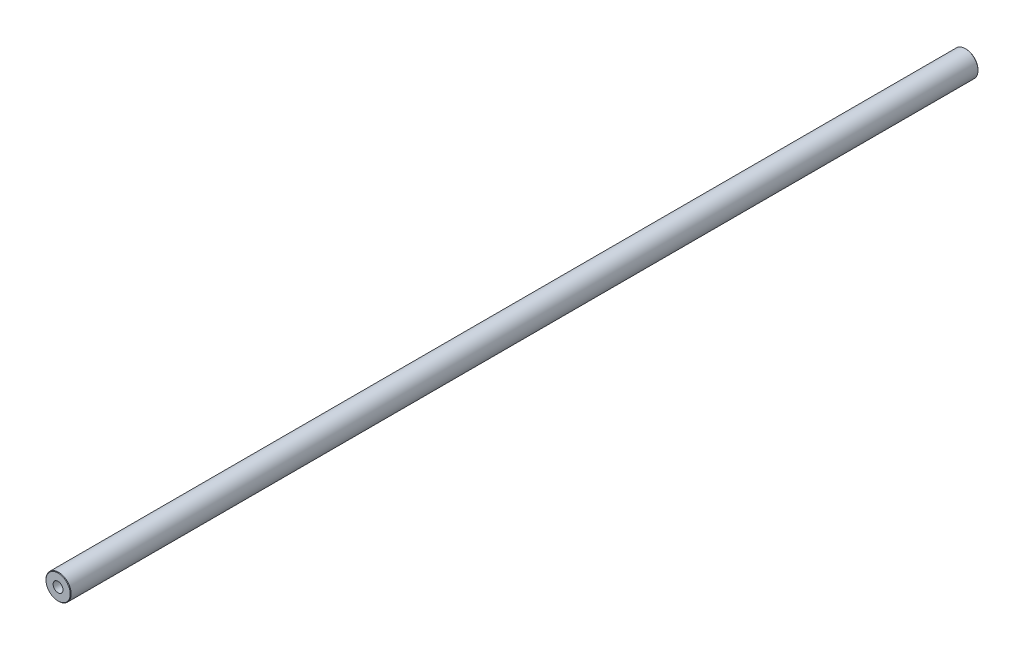
ISO-10303-21;
HEADER;
FILE_DESCRIPTION(('STEP AP214'),'2;1');
FILE_NAME('part.step','',(''),(''),'','','');
FILE_SCHEMA(('AUTOMOTIVE_DESIGN { 1 0 10303 214 1 1 1 1 }'));
ENDSEC;
DATA;
#1=APPLICATION_CONTEXT('core data for automotive mechanical design processes');
#2=APPLICATION_PROTOCOL_DEFINITION('international standard','automotive_design',2000,#1);
#3=PRODUCT_CONTEXT('',#1,'mechanical');
#4=PRODUCT('Part','Part','',(#3));
#5=PRODUCT_RELATED_PRODUCT_CATEGORY('part','',(#4));
#6=PRODUCT_DEFINITION_FORMATION('','',#4);
#7=PRODUCT_DEFINITION_CONTEXT('part definition',#1,'design');
#8=PRODUCT_DEFINITION('design','',#6,#7);
#9=PRODUCT_DEFINITION_SHAPE('','',#8);
#10=(LENGTH_UNIT() NAMED_UNIT(*) SI_UNIT(.MILLI.,.METRE.));
#11=(NAMED_UNIT(*) PLANE_ANGLE_UNIT() SI_UNIT($,.RADIAN.));
#12=(NAMED_UNIT(*) SI_UNIT($,.STERADIAN.) SOLID_ANGLE_UNIT());
#13=UNCERTAINTY_MEASURE_WITH_UNIT(LENGTH_MEASURE(1.E-05),#10,'distance_accuracy_value','');
#14=(GEOMETRIC_REPRESENTATION_CONTEXT(3) GLOBAL_UNCERTAINTY_ASSIGNED_CONTEXT((#13)) GLOBAL_UNIT_ASSIGNED_CONTEXT((#10,
#11,#12)) REPRESENTATION_CONTEXT('',''));
#15=CARTESIAN_POINT('',(0.,0.,0.));
#16=DIRECTION('',(0.,0.,1.));
#17=DIRECTION('',(1.,0.,0.));
#18=AXIS2_PLACEMENT_3D('',#15,#16,#17);
#19=CARTESIAN_POINT('',(0.,0.,228.6));
#20=DIRECTION('',(0.,0.,-1.));
#21=DIRECTION('',(-1.,0.,0.));
#22=AXIS2_PLACEMENT_3D('',#19,#20,#21);
#23=CYLINDRICAL_SURFACE('',#22,6.35);
#24=CARTESIAN_POINT('',(0.,0.,-228.346));
#25=DIRECTION('',(0.,0.,1.));
#26=DIRECTION('',(1.,0.,0.));
#27=AXIS2_PLACEMENT_3D('',#24,#25,#26);
#28=CIRCLE('',#27,6.35);
#29=CARTESIAN_POINT('',(6.35,0.,-228.346));
#30=VERTEX_POINT('',#29);
#31=EDGE_CURVE('E84',#30,#30,#28,.T.);
#32=ORIENTED_EDGE('',*,*,#31,.T.);
#33=EDGE_LOOP('',(#32));
#34=FACE_BOUND('',#33,.T.);
#35=CARTESIAN_POINT('',(0.,0.,228.346));
#36=DIRECTION('',(0.,0.,1.));
#37=DIRECTION('',(1.,0.,0.));
#38=AXIS2_PLACEMENT_3D('',#35,#36,#37);
#39=CIRCLE('',#38,6.35);
#40=CARTESIAN_POINT('',(6.35,0.,228.346));
#41=VERTEX_POINT('',#40);
#42=EDGE_CURVE('E80',#41,#41,#39,.F.);
#43=ORIENTED_EDGE('',*,*,#42,.T.);
#44=EDGE_LOOP('',(#43));
#45=FACE_BOUND('',#44,.T.);
#46=ADVANCED_FACE('F44',(#34,#45),#23,.T.);
#47=CARTESIAN_POINT('',(0.,0.,228.6));
#48=DIRECTION('',(0.,0.,1.));
#49=DIRECTION('',(1.,0.,0.));
#50=AXIS2_PLACEMENT_3D('',#47,#48,#49);
#51=PLANE('',#50);
#52=CARTESIAN_POINT('',(0.,0.,228.6));
#53=DIRECTION('',(0.,0.,1.));
#54=DIRECTION('',(1.,0.,0.));
#55=AXIS2_PLACEMENT_3D('',#52,#53,#54);
#56=CIRCLE('',#55,2.49999999999999);
#57=CARTESIAN_POINT('',(2.49999999999999,0.,228.6));
#58=VERTEX_POINT('',#57);
#59=EDGE_CURVE('E69',#58,#58,#56,.T.);
#60=ORIENTED_EDGE('',*,*,#59,.F.);
#61=EDGE_LOOP('',(#60));
#62=FACE_BOUND('',#61,.T.);
#63=CARTESIAN_POINT('',(0.,0.,228.6));
#64=DIRECTION('',(0.,0.,1.));
#65=DIRECTION('',(1.,0.,0.));
#66=AXIS2_PLACEMENT_3D('',#63,#64,#65);
#67=CIRCLE('',#66,6.09600000000005);
#68=CARTESIAN_POINT('',(6.09600000000005,0.,228.6));
#69=VERTEX_POINT('',#68);
#70=EDGE_CURVE('E11',#69,#69,#67,.T.);
#71=ORIENTED_EDGE('',*,*,#70,.T.);
#72=EDGE_LOOP('',(#71));
#73=FACE_BOUND('',#72,.T.);
#74=ADVANCED_FACE('F101',(#62,#73),#51,.T.);
#75=CARTESIAN_POINT('',(0.,0.,-228.6));
#76=DIRECTION('',(0.,0.,1.));
#77=DIRECTION('',(1.,0.,0.));
#78=AXIS2_PLACEMENT_3D('',#75,#76,#77);
#79=PLANE('',#78);
#80=CARTESIAN_POINT('',(0.,0.,-228.6));
#81=DIRECTION('',(0.,0.,-1.));
#82=DIRECTION('',(-1.,0.,0.));
#83=AXIS2_PLACEMENT_3D('',#80,#81,#82);
#84=CIRCLE('',#83,2.49999999999999);
#85=CARTESIAN_POINT('',(-2.49999999999999,0.,-228.6));
#86=VERTEX_POINT('',#85);
#87=EDGE_CURVE('E70',#86,#86,#84,.T.);
#88=ORIENTED_EDGE('',*,*,#87,.F.);
#89=EDGE_LOOP('',(#88));
#90=FACE_BOUND('',#89,.T.);
#91=CARTESIAN_POINT('',(0.,0.,-228.6));
#92=DIRECTION('',(0.,0.,1.));
#93=DIRECTION('',(1.,0.,0.));
#94=AXIS2_PLACEMENT_3D('',#91,#92,#93);
#95=CIRCLE('',#94,6.09599999999999);
#96=CARTESIAN_POINT('',(6.09599999999999,0.,-228.6));
#97=VERTEX_POINT('',#96);
#98=EDGE_CURVE('E53',#97,#97,#95,.F.);
#99=ORIENTED_EDGE('',*,*,#98,.T.);
#100=EDGE_LOOP('',(#99));
#101=FACE_BOUND('',#100,.T.);
#102=ADVANCED_FACE('F92',(#90,#101),#79,.F.);
#103=CARTESIAN_POINT('',(0.,0.,-228.346));
#104=DIRECTION('',(0.,0.,1.));
#105=DIRECTION('',(1.,0.,0.));
#106=AXIS2_PLACEMENT_3D('',#103,#104,#105);
#107=CONICAL_SURFACE('',#106,6.35,0.785398163397404);
#108=ORIENTED_EDGE('',*,*,#98,.F.);
#109=EDGE_LOOP('',(#108));
#110=FACE_BOUND('',#109,.T.);
#111=ORIENTED_EDGE('',*,*,#31,.F.);
#112=EDGE_LOOP('',(#111));
#113=FACE_BOUND('',#112,.T.);
#114=ADVANCED_FACE('F94',(#110,#113),#107,.T.);
#115=CARTESIAN_POINT('',(0.,0.,228.6));
#116=DIRECTION('',(0.,0.,-1.));
#117=DIRECTION('',(-1.,0.,0.));
#118=AXIS2_PLACEMENT_3D('',#115,#116,#117);
#119=CONICAL_SURFACE('',#118,6.09600000000005,0.785398163397404);
#120=ORIENTED_EDGE('',*,*,#42,.F.);
#121=EDGE_LOOP('',(#120));
#122=FACE_BOUND('',#121,.T.);
#123=ORIENTED_EDGE('',*,*,#70,.F.);
#124=EDGE_LOOP('',(#123));
#125=FACE_BOUND('',#124,.T.);
#126=ADVANCED_FACE('F46',(#122,#125),#119,.T.);
#127=CARTESIAN_POINT('',(0.,0.,203.6));
#128=DIRECTION('',(0.,0.,1.));
#129=DIRECTION('',(1.,0.,0.));
#130=AXIS2_PLACEMENT_3D('',#127,#128,#129);
#131=CONICAL_SURFACE('',#130,2.49999999999999,1.02974425867665);
#132=CARTESIAN_POINT('',(0.,0.,202.097848452431));
#133=VERTEX_POINT('',#132);
#134=VERTEX_LOOP('',#133);
#135=FACE_BOUND('',#134,.T.);
#136=CARTESIAN_POINT('',(0.,0.,203.6));
#137=DIRECTION('',(0.,0.,1.));
#138=DIRECTION('',(1.,0.,0.));
#139=AXIS2_PLACEMENT_3D('',#136,#137,#138);
#140=CIRCLE('',#139,2.49999999999999);
#141=CARTESIAN_POINT('',(2.49999999999999,0.,203.6));
#142=VERTEX_POINT('',#141);
#143=EDGE_CURVE('E73',#142,#142,#140,.T.);
#144=ORIENTED_EDGE('',*,*,#143,.T.);
#145=EDGE_LOOP('',(#144));
#146=FACE_BOUND('',#145,.T.);
#147=ADVANCED_FACE('F107',(#135,#146),#131,.F.);
#148=CARTESIAN_POINT('',(0.,0.,228.6));
#149=DIRECTION('',(0.,0.,1.));
#150=DIRECTION('',(1.,0.,0.));
#151=AXIS2_PLACEMENT_3D('',#148,#149,#150);
#152=CYLINDRICAL_SURFACE('',#151,2.49999999999999);
#153=ORIENTED_EDGE('',*,*,#143,.F.);
#154=EDGE_LOOP('',(#153));
#155=FACE_BOUND('',#154,.T.);
#156=ORIENTED_EDGE('',*,*,#59,.T.);
#157=EDGE_LOOP('',(#156));
#158=FACE_BOUND('',#157,.T.);
#159=ADVANCED_FACE('F63',(#155,#158),#152,.F.);
#160=CARTESIAN_POINT('',(0.,0.,-203.6));
#161=DIRECTION('',(0.,0.,-1.));
#162=DIRECTION('',(-1.,0.,0.));
#163=AXIS2_PLACEMENT_3D('',#160,#161,#162);
#164=CONICAL_SURFACE('',#163,2.49999999999999,1.02974425867665);
#165=CARTESIAN_POINT('',(0.,0.,-202.097848452431));
#166=VERTEX_POINT('',#165);
#167=VERTEX_LOOP('',#166);
#168=FACE_BOUND('',#167,.T.);
#169=CARTESIAN_POINT('',(0.,0.,-203.6));
#170=DIRECTION('',(0.,0.,-1.));
#171=DIRECTION('',(-1.,0.,0.));
#172=AXIS2_PLACEMENT_3D('',#169,#170,#171);
#173=CIRCLE('',#172,2.49999999999999);
#174=CARTESIAN_POINT('',(-2.49999999999999,0.,-203.6));
#175=VERTEX_POINT('',#174);
#176=EDGE_CURVE('E67',#175,#175,#173,.T.);
#177=ORIENTED_EDGE('',*,*,#176,.T.);
#178=EDGE_LOOP('',(#177));
#179=FACE_BOUND('',#178,.T.);
#180=ADVANCED_FACE('F59',(#168,#179),#164,.F.);
#181=CARTESIAN_POINT('',(0.,0.,-228.6));
#182=DIRECTION('',(0.,0.,-1.));
#183=DIRECTION('',(-1.,0.,0.));
#184=AXIS2_PLACEMENT_3D('',#181,#182,#183);
#185=CYLINDRICAL_SURFACE('',#184,2.49999999999999);
#186=ORIENTED_EDGE('',*,*,#176,.F.);
#187=EDGE_LOOP('',(#186));
#188=FACE_BOUND('',#187,.T.);
#189=ORIENTED_EDGE('',*,*,#87,.T.);
#190=EDGE_LOOP('',(#189));
#191=FACE_BOUND('',#190,.T.);
#192=ADVANCED_FACE('F62',(#188,#191),#185,.F.);
#193=CLOSED_SHELL('',(#46,#74,#102,#114,#126,#147,#159,#180,#192));
#194=MANIFOLD_SOLID_BREP('B2',#193);
#195=ADVANCED_BREP_SHAPE_REPRESENTATION('',(#18,#194),#14);
#196=SHAPE_DEFINITION_REPRESENTATION(#9,#195);
ENDSEC;
END-ISO-10303-21;
